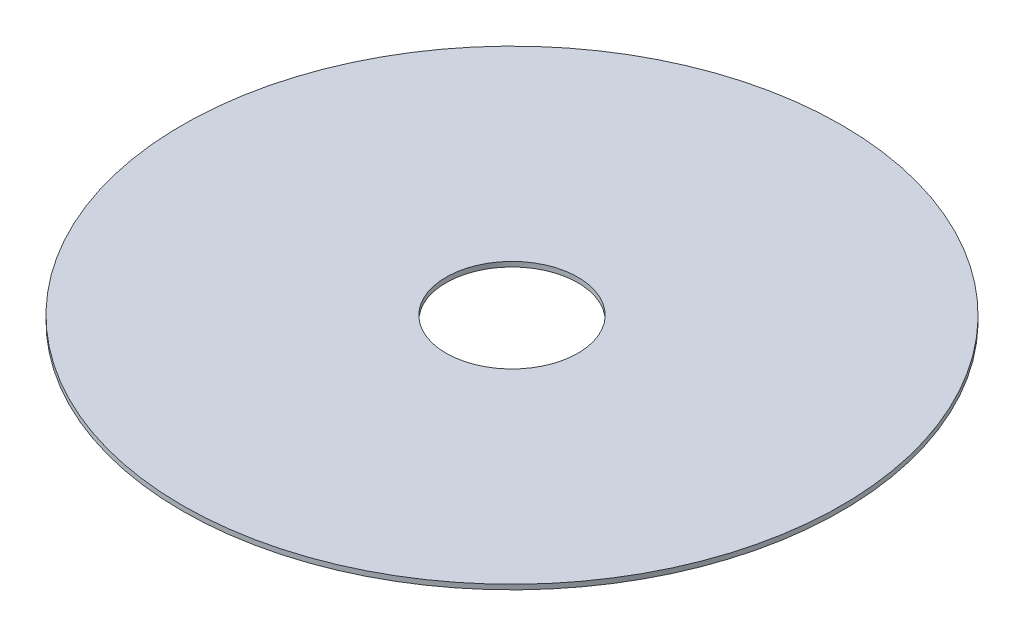
ISO-10303-21;
HEADER;
FILE_DESCRIPTION(('STEP AP214'),'2;1');
FILE_NAME('part.step','',(''),(''),'','','');
FILE_SCHEMA(('AUTOMOTIVE_DESIGN { 1 0 10303 214 1 1 1 1 }'));
ENDSEC;
DATA;
#1=APPLICATION_CONTEXT('core data for automotive mechanical design processes');
#2=APPLICATION_PROTOCOL_DEFINITION('international standard','automotive_design',2000,#1);
#3=PRODUCT_CONTEXT('',#1,'mechanical');
#4=PRODUCT('Part','Part','',(#3));
#5=PRODUCT_RELATED_PRODUCT_CATEGORY('part','',(#4));
#6=PRODUCT_DEFINITION_FORMATION('','',#4);
#7=PRODUCT_DEFINITION_CONTEXT('part definition',#1,'design');
#8=PRODUCT_DEFINITION('design','',#6,#7);
#9=PRODUCT_DEFINITION_SHAPE('','',#8);
#10=(LENGTH_UNIT() NAMED_UNIT(*) SI_UNIT(.MILLI.,.METRE.));
#11=(NAMED_UNIT(*) PLANE_ANGLE_UNIT() SI_UNIT($,.RADIAN.));
#12=(NAMED_UNIT(*) SI_UNIT($,.STERADIAN.) SOLID_ANGLE_UNIT());
#13=UNCERTAINTY_MEASURE_WITH_UNIT(LENGTH_MEASURE(1.E-05),#10,'distance_accuracy_value','');
#14=(GEOMETRIC_REPRESENTATION_CONTEXT(3) GLOBAL_UNCERTAINTY_ASSIGNED_CONTEXT((#13)) GLOBAL_UNIT_ASSIGNED_CONTEXT((#10,
#11,#12)) REPRESENTATION_CONTEXT('',''));
#15=CARTESIAN_POINT('',(0.,0.,0.));
#16=DIRECTION('',(0.,0.,1.));
#17=DIRECTION('',(1.,0.,0.));
#18=AXIS2_PLACEMENT_3D('',#15,#16,#17);
#19=CARTESIAN_POINT('',(0.,-0.7366,0.));
#20=DIRECTION('',(0.,1.,0.));
#21=DIRECTION('',(0.,0.,1.));
#22=AXIS2_PLACEMENT_3D('',#19,#20,#21);
#23=CYLINDRICAL_SURFACE('',#22,50.);
#24=CARTESIAN_POINT('',(0.,-0.7366,0.));
#25=DIRECTION('',(0.,1.,0.));
#26=DIRECTION('',(0.,0.,1.));
#27=AXIS2_PLACEMENT_3D('',#24,#25,#26);
#28=CIRCLE('',#27,50.);
#29=CARTESIAN_POINT('',(0.,-0.7366,50.));
#30=VERTEX_POINT('',#29);
#31=EDGE_CURVE('E10',#30,#30,#28,.T.);
#32=ORIENTED_EDGE('',*,*,#31,.T.);
#33=EDGE_LOOP('',(#32));
#34=FACE_BOUND('',#33,.T.);
#35=CARTESIAN_POINT('',(0.,0.,0.));
#36=DIRECTION('',(0.,1.,0.));
#37=DIRECTION('',(0.,0.,1.));
#38=AXIS2_PLACEMENT_3D('',#35,#36,#37);
#39=CIRCLE('',#38,50.);
#40=CARTESIAN_POINT('',(0.,0.,50.));
#41=VERTEX_POINT('',#40);
#42=EDGE_CURVE('E38',#41,#41,#39,.T.);
#43=ORIENTED_EDGE('',*,*,#42,.F.);
#44=EDGE_LOOP('',(#43));
#45=FACE_BOUND('',#44,.T.);
#46=ADVANCED_FACE('F35',(#34,#45),#23,.T.);
#47=CARTESIAN_POINT('',(0.,-0.7366,0.));
#48=DIRECTION('',(0.,1.,0.));
#49=DIRECTION('',(0.,0.,1.));
#50=AXIS2_PLACEMENT_3D('',#47,#48,#49);
#51=PLANE('',#50);
#52=CARTESIAN_POINT('',(0.,-0.7366,0.));
#53=DIRECTION('',(0.,1.,0.));
#54=DIRECTION('',(0.,0.,1.));
#55=AXIS2_PLACEMENT_3D('',#52,#53,#54);
#56=CIRCLE('',#55,10.);
#57=CARTESIAN_POINT('',(0.,-0.7366,10.));
#58=VERTEX_POINT('',#57);
#59=EDGE_CURVE('E45',#58,#58,#56,.T.);
#60=ORIENTED_EDGE('',*,*,#59,.T.);
#61=EDGE_LOOP('',(#60));
#62=FACE_BOUND('',#61,.T.);
#63=ORIENTED_EDGE('',*,*,#31,.F.);
#64=EDGE_LOOP('',(#63));
#65=FACE_BOUND('',#64,.T.);
#66=ADVANCED_FACE('F53',(#62,#65),#51,.F.);
#67=CARTESIAN_POINT('',(0.,0.,0.));
#68=DIRECTION('',(0.,1.,0.));
#69=DIRECTION('',(0.,0.,1.));
#70=AXIS2_PLACEMENT_3D('',#67,#68,#69);
#71=PLANE('',#70);
#72=CARTESIAN_POINT('',(0.,0.,0.));
#73=DIRECTION('',(0.,1.,0.));
#74=DIRECTION('',(0.,0.,1.));
#75=AXIS2_PLACEMENT_3D('',#72,#73,#74);
#76=CIRCLE('',#75,10.);
#77=CARTESIAN_POINT('',(0.,0.,10.));
#78=VERTEX_POINT('',#77);
#79=EDGE_CURVE('E47',#78,#78,#76,.T.);
#80=ORIENTED_EDGE('',*,*,#79,.F.);
#81=EDGE_LOOP('',(#80));
#82=FACE_BOUND('',#81,.T.);
#83=ORIENTED_EDGE('',*,*,#42,.T.);
#84=EDGE_LOOP('',(#83));
#85=FACE_BOUND('',#84,.T.);
#86=ADVANCED_FACE('F59',(#82,#85),#71,.T.);
#87=CARTESIAN_POINT('',(0.,-0.7366,0.));
#88=DIRECTION('',(0.,1.,0.));
#89=DIRECTION('',(0.,0.,1.));
#90=AXIS2_PLACEMENT_3D('',#87,#88,#89);
#91=CYLINDRICAL_SURFACE('',#90,10.);
#92=ORIENTED_EDGE('',*,*,#59,.F.);
#93=EDGE_LOOP('',(#92));
#94=FACE_BOUND('',#93,.T.);
#95=ORIENTED_EDGE('',*,*,#79,.T.);
#96=EDGE_LOOP('',(#95));
#97=FACE_BOUND('',#96,.T.);
#98=ADVANCED_FACE('F56',(#94,#97),#91,.F.);
#99=CLOSED_SHELL('',(#46,#66,#86,#98));
#100=MANIFOLD_SOLID_BREP('B2',#99);
#101=ADVANCED_BREP_SHAPE_REPRESENTATION('',(#18,#100),#14);
#102=SHAPE_DEFINITION_REPRESENTATION(#9,#101);
ENDSEC;
END-ISO-10303-21;
